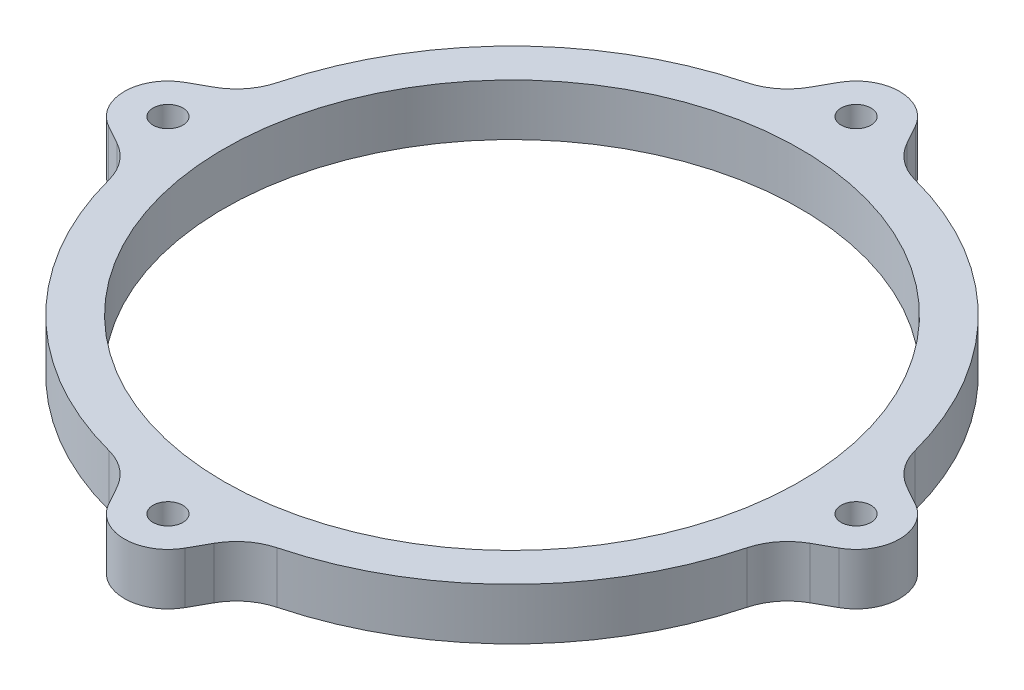
ISO-10303-21;
HEADER;
FILE_DESCRIPTION(('STEP AP214'),'2;1');
FILE_NAME('part.step','',(''),(''),'','','');
FILE_SCHEMA(('AUTOMOTIVE_DESIGN { 1 0 10303 214 1 1 1 1 }'));
ENDSEC;
DATA;
#1=APPLICATION_CONTEXT('core data for automotive mechanical design processes');
#2=APPLICATION_PROTOCOL_DEFINITION('international standard','automotive_design',2000,#1);
#3=PRODUCT_CONTEXT('',#1,'mechanical');
#4=PRODUCT('Part','Part','',(#3));
#5=PRODUCT_RELATED_PRODUCT_CATEGORY('part','',(#4));
#6=PRODUCT_DEFINITION_FORMATION('','',#4);
#7=PRODUCT_DEFINITION_CONTEXT('part definition',#1,'design');
#8=PRODUCT_DEFINITION('design','',#6,#7);
#9=PRODUCT_DEFINITION_SHAPE('','',#8);
#10=(LENGTH_UNIT() NAMED_UNIT(*) SI_UNIT(.MILLI.,.METRE.));
#11=(NAMED_UNIT(*) PLANE_ANGLE_UNIT() SI_UNIT($,.RADIAN.));
#12=(NAMED_UNIT(*) SI_UNIT($,.STERADIAN.) SOLID_ANGLE_UNIT());
#13=UNCERTAINTY_MEASURE_WITH_UNIT(LENGTH_MEASURE(1.E-05),#10,'distance_accuracy_value','');
#14=(GEOMETRIC_REPRESENTATION_CONTEXT(3) GLOBAL_UNCERTAINTY_ASSIGNED_CONTEXT((#13)) GLOBAL_UNIT_ASSIGNED_CONTEXT((#10,
#11,#12)) REPRESENTATION_CONTEXT('',''));
#15=CARTESIAN_POINT('',(0.,0.,0.));
#16=DIRECTION('',(0.,0.,1.));
#17=DIRECTION('',(1.,0.,0.));
#18=AXIS2_PLACEMENT_3D('',#15,#16,#17);
#19=CARTESIAN_POINT('',(0.,9.,-60.));
#20=DIRECTION('',(0.,1.,0.));
#21=DIRECTION('',(0.,0.,1.));
#22=AXIS2_PLACEMENT_3D('',#19,#20,#21);
#23=PLANE('',#22);
#24=CARTESIAN_POINT('',(0.,9.,59.9999999999995));
#25=DIRECTION('',(0.,1.,0.));
#26=DIRECTION('',(0.,0.,1.));
#27=AXIS2_PLACEMENT_3D('',#24,#25,#26);
#28=CIRCLE('',#27,2.6);
#29=CARTESIAN_POINT('',(0.,9.,62.5999999999995));
#30=VERTEX_POINT('',#29);
#31=EDGE_CURVE('E439',#30,#30,#28,.T.);
#32=ORIENTED_EDGE('',*,*,#31,.F.);
#33=EDGE_LOOP('',(#32));
#34=FACE_BOUND('',#33,.T.);
#35=CARTESIAN_POINT('',(0.,9.,-60.));
#36=DIRECTION('',(0.,1.,0.));
#37=DIRECTION('',(0.,0.,1.));
#38=AXIS2_PLACEMENT_3D('',#35,#36,#37);
#39=CIRCLE('',#38,2.6);
#40=CARTESIAN_POINT('',(0.,9.,-57.4));
#41=VERTEX_POINT('',#40);
#42=EDGE_CURVE('E427',#41,#41,#39,.T.);
#43=ORIENTED_EDGE('',*,*,#42,.F.);
#44=EDGE_LOOP('',(#43));
#45=FACE_BOUND('',#44,.T.);
#46=CARTESIAN_POINT('',(0.,9.,-60.));
#47=DIRECTION('',(0.,1.,0.));
#48=DIRECTION('',(0.,0.,1.));
#49=AXIS2_PLACEMENT_3D('',#46,#47,#48);
#50=CIRCLE('',#49,7.6);
#51=CARTESIAN_POINT('',(6.64110523457601,9.,-63.6953648349367));
#52=VERTEX_POINT('',#51);
#53=CARTESIAN_POINT('',(-6.64110523457602,9.,-63.6953648349367));
#54=VERTEX_POINT('',#53);
#55=EDGE_CURVE('E206',#52,#54,#50,.T.);
#56=ORIENTED_EDGE('',*,*,#55,.T.);
#57=DIRECTION('',(-0.486232215123255,0.,0.873829636128423));
#58=VECTOR('',#57,1.);
#59=CARTESIAN_POINT('',(-6.64110523457602,9.,-63.6953648349367));
#60=LINE('',#59,#58);
#61=CARTESIAN_POINT('',(-8.47082751707202,9.,-60.4070891785731));
#62=VERTEX_POINT('',#61);
#63=EDGE_CURVE('E194',#54,#62,#60,.T.);
#64=ORIENTED_EDGE('',*,*,#63,.T.);
#65=CARTESIAN_POINT('',(-17.2091238783562,9.,-65.2694113298057));
#66=DIRECTION('',(0.,1.,0.));
#67=DIRECTION('',(0.,0.,1.));
#68=AXIS2_PLACEMENT_3D('',#65,#66,#67);
#69=CIRCLE('',#68,10.);
#70=CARTESIAN_POINT('',(-14.6596240445257,9.,-55.5998689105752));
#71=VERTEX_POINT('',#70);
#72=EDGE_CURVE('E279',#62,#71,#69,.F.);
#73=ORIENTED_EDGE('',*,*,#72,.T.);
#74=CARTESIAN_POINT('',(0.,9.,0.));
#75=DIRECTION('',(0.,1.,0.));
#76=DIRECTION('',(0.,0.,1.));
#77=AXIS2_PLACEMENT_3D('',#74,#75,#76);
#78=CIRCLE('',#77,57.4999999999999);
#79=CARTESIAN_POINT('',(-55.5998689105752,9.,-14.6596240445258));
#80=VERTEX_POINT('',#79);
#81=EDGE_CURVE('E205',#71,#80,#78,.T.);
#82=ORIENTED_EDGE('',*,*,#81,.T.);
#83=CARTESIAN_POINT('',(-65.2694113298057,9.,-17.2091238783564));
#84=DIRECTION('',(0.,1.,0.));
#85=DIRECTION('',(0.,0.,1.));
#86=AXIS2_PLACEMENT_3D('',#83,#84,#85);
#87=CIRCLE('',#86,10.);
#88=CARTESIAN_POINT('',(-60.4070891785731,9.,-8.47082751707214));
#89=VERTEX_POINT('',#88);
#90=EDGE_CURVE('E283',#80,#89,#87,.F.);
#91=ORIENTED_EDGE('',*,*,#90,.T.);
#92=DIRECTION('',(-0.873829636128424,0.,0.486232215123254));
#93=VECTOR('',#92,1.);
#94=CARTESIAN_POINT('',(-63.6953648349364,9.,-6.64110523457632));
#95=LINE('',#94,#93);
#96=CARTESIAN_POINT('',(-63.6953648349363,9.,-6.6411052345761));
#97=VERTEX_POINT('',#96);
#98=EDGE_CURVE('E377',#89,#97,#95,.T.);
#99=ORIENTED_EDGE('',*,*,#98,.T.);
#100=CARTESIAN_POINT('',(-59.9999999999997,9.,0.));
#101=DIRECTION('',(0.,1.,0.));
#102=DIRECTION('',(0.,0.,1.));
#103=AXIS2_PLACEMENT_3D('',#100,#101,#102);
#104=CIRCLE('',#103,7.59999999999999);
#105=CARTESIAN_POINT('',(-63.6953648349364,9.,6.6411052345757));
#106=VERTEX_POINT('',#105);
#107=EDGE_CURVE('E374',#97,#106,#104,.T.);
#108=ORIENTED_EDGE('',*,*,#107,.T.);
#109=DIRECTION('',(0.873829636128421,0.,0.486232215123259));
#110=VECTOR('',#109,1.);
#111=CARTESIAN_POINT('',(-63.6953648349364,9.,6.6411052345757));
#112=LINE('',#111,#110);
#113=CARTESIAN_POINT('',(-60.407089178573,9.,8.47082751707166));
#114=VERTEX_POINT('',#113);
#115=EDGE_CURVE('E366',#106,#114,#112,.T.);
#116=ORIENTED_EDGE('',*,*,#115,.T.);
#117=CARTESIAN_POINT('',(-65.2694113298056,9.,17.2091238783559));
#118=DIRECTION('',(0.,1.,0.));
#119=DIRECTION('',(0.,0.,1.));
#120=AXIS2_PLACEMENT_3D('',#117,#118,#119);
#121=CIRCLE('',#120,10.);
#122=CARTESIAN_POINT('',(-55.5998689105751,9.,14.6596240445254));
#123=VERTEX_POINT('',#122);
#124=EDGE_CURVE('E287',#114,#123,#121,.F.);
#125=ORIENTED_EDGE('',*,*,#124,.T.);
#126=CARTESIAN_POINT('',(0.,9.,0.));
#127=DIRECTION('',(0.,1.,0.));
#128=DIRECTION('',(0.,0.,1.));
#129=AXIS2_PLACEMENT_3D('',#126,#127,#128);
#130=CIRCLE('',#129,57.4999999999996);
#131=CARTESIAN_POINT('',(-14.6596240445255,9.,55.599868910575));
#132=VERTEX_POINT('',#131);
#133=EDGE_CURVE('E298',#123,#132,#130,.T.);
#134=ORIENTED_EDGE('',*,*,#133,.T.);
#135=CARTESIAN_POINT('',(-17.209123878356,9.,65.2694113298055));
#136=DIRECTION('',(0.,1.,0.));
#137=DIRECTION('',(0.,0.,1.));
#138=AXIS2_PLACEMENT_3D('',#135,#136,#137);
#139=CIRCLE('',#138,10.);
#140=CARTESIAN_POINT('',(-8.47082751707182,9.,60.407089178573));
#141=VERTEX_POINT('',#140);
#142=EDGE_CURVE('E291',#132,#141,#139,.F.);
#143=ORIENTED_EDGE('',*,*,#142,.T.);
#144=DIRECTION('',(0.486232215123255,0.,0.873829636128423));
#145=VECTOR('',#144,1.);
#146=CARTESIAN_POINT('',(-6.64110523457596,9.,63.6953648349363));
#147=LINE('',#146,#145);
#148=CARTESIAN_POINT('',(-6.64110523457601,9.,63.6953648349363));
#149=VERTEX_POINT('',#148);
#150=EDGE_CURVE('E295',#141,#149,#147,.T.);
#151=ORIENTED_EDGE('',*,*,#150,.T.);
#152=CARTESIAN_POINT('',(0.,9.,59.9999999999995));
#153=DIRECTION('',(0.,1.,0.));
#154=DIRECTION('',(0.,0.,1.));
#155=AXIS2_PLACEMENT_3D('',#152,#153,#154);
#156=CIRCLE('',#155,7.60000000000002);
#157=CARTESIAN_POINT('',(6.64110523457607,9.,63.6953648349363));
#158=VERTEX_POINT('',#157);
#159=EDGE_CURVE('E308',#149,#158,#156,.T.);
#160=ORIENTED_EDGE('',*,*,#159,.T.);
#161=DIRECTION('',(0.486232215123259,0.,-0.873829636128421));
#162=VECTOR('',#161,1.);
#163=CARTESIAN_POINT('',(6.64110523457607,9.,63.6953648349363));
#164=LINE('',#163,#162);
#165=CARTESIAN_POINT('',(8.47082751707193,9.,60.407089178573));
#166=VERTEX_POINT('',#165);
#167=EDGE_CURVE('E382',#158,#166,#164,.T.);
#168=ORIENTED_EDGE('',*,*,#167,.T.);
#169=CARTESIAN_POINT('',(17.2091238783561,9.,65.2694113298056));
#170=DIRECTION('',(0.,1.,0.));
#171=DIRECTION('',(0.,0.,1.));
#172=AXIS2_PLACEMENT_3D('',#169,#170,#171);
#173=CIRCLE('',#172,10.);
#174=CARTESIAN_POINT('',(14.6596240445256,9.,55.5998689105751));
#175=VERTEX_POINT('',#174);
#176=EDGE_CURVE('E11',#166,#175,#173,.F.);
#177=ORIENTED_EDGE('',*,*,#176,.T.);
#178=CARTESIAN_POINT('',(0.,9.,0.));
#179=DIRECTION('',(0.,1.,0.));
#180=DIRECTION('',(0.,0.,1.));
#181=AXIS2_PLACEMENT_3D('',#178,#179,#180);
#182=CIRCLE('',#181,57.4999999999997);
#183=CARTESIAN_POINT('',(55.5998689105752,9.,14.6596240445254));
#184=VERTEX_POINT('',#183);
#185=EDGE_CURVE('E384',#175,#184,#182,.T.);
#186=ORIENTED_EDGE('',*,*,#185,.T.);
#187=CARTESIAN_POINT('',(65.2694113298056,9.,17.209123878356));
#188=DIRECTION('',(0.,1.,0.));
#189=DIRECTION('',(0.,0.,1.));
#190=AXIS2_PLACEMENT_3D('',#187,#188,#189);
#191=CIRCLE('',#190,10.);
#192=CARTESIAN_POINT('',(60.4070891785731,9.,8.47082751707175));
#193=VERTEX_POINT('',#192);
#194=EDGE_CURVE('E267',#184,#193,#191,.F.);
#195=ORIENTED_EDGE('',*,*,#194,.T.);
#196=DIRECTION('',(0.873829636128423,0.,-0.486232215123256));
#197=VECTOR('',#196,1.);
#198=CARTESIAN_POINT('',(63.6953648349366,9.,6.64110523457578));
#199=LINE('',#198,#197);
#200=CARTESIAN_POINT('',(63.6953648349365,9.,6.64110523457553));
#201=VERTEX_POINT('',#200);
#202=EDGE_CURVE('E387',#193,#201,#199,.T.);
#203=ORIENTED_EDGE('',*,*,#202,.T.);
#204=CARTESIAN_POINT('',(59.9999999999999,9.,-5.62050406216485E-13));
#205=DIRECTION('',(0.,1.,0.));
#206=DIRECTION('',(0.,0.,1.));
#207=AXIS2_PLACEMENT_3D('',#204,#205,#206);
#208=CIRCLE('',#207,7.59999999999999);
#209=CARTESIAN_POINT('',(63.6953648349367,9.,-6.64110523457625));
#210=VERTEX_POINT('',#209);
#211=EDGE_CURVE('E389',#201,#210,#208,.T.);
#212=ORIENTED_EDGE('',*,*,#211,.T.);
#213=DIRECTION('',(-0.873829636128422,0.,-0.486232215123257));
#214=VECTOR('',#213,1.);
#215=CARTESIAN_POINT('',(63.6953648349367,9.,-6.64110523457625));
#216=LINE('',#215,#214);
#217=CARTESIAN_POINT('',(60.4070891785732,9.,-8.47082751707216));
#218=VERTEX_POINT('',#217);
#219=EDGE_CURVE('E391',#210,#218,#216,.T.);
#220=ORIENTED_EDGE('',*,*,#219,.T.);
#221=CARTESIAN_POINT('',(65.2694113298058,9.,-17.2091238783564));
#222=DIRECTION('',(0.,1.,0.));
#223=DIRECTION('',(0.,0.,1.));
#224=AXIS2_PLACEMENT_3D('',#221,#222,#223);
#225=CIRCLE('',#224,10.);
#226=CARTESIAN_POINT('',(55.5998689105753,9.,-14.6596240445258));
#227=VERTEX_POINT('',#226);
#228=EDGE_CURVE('E271',#218,#227,#225,.F.);
#229=ORIENTED_EDGE('',*,*,#228,.T.);
#230=CARTESIAN_POINT('',(0.,9.,0.));
#231=DIRECTION('',(0.,1.,0.));
#232=DIRECTION('',(0.,0.,1.));
#233=AXIS2_PLACEMENT_3D('',#230,#231,#232);
#234=CIRCLE('',#233,57.5);
#235=CARTESIAN_POINT('',(14.6596240445256,9.,-55.5998689105754));
#236=VERTEX_POINT('',#235);
#237=EDGE_CURVE('E394',#227,#236,#234,.T.);
#238=ORIENTED_EDGE('',*,*,#237,.T.);
#239=CARTESIAN_POINT('',(17.2091238783562,9.,-65.2694113298058));
#240=DIRECTION('',(0.,1.,0.));
#241=DIRECTION('',(0.,0.,1.));
#242=AXIS2_PLACEMENT_3D('',#239,#240,#241);
#243=CIRCLE('',#242,10.);
#244=CARTESIAN_POINT('',(8.47082751707194,9.,-60.4070891785733));
#245=VERTEX_POINT('',#244);
#246=EDGE_CURVE('E275',#236,#245,#243,.F.);
#247=ORIENTED_EDGE('',*,*,#246,.T.);
#248=DIRECTION('',(-0.486232215123257,0.,-0.873829636128422));
#249=VECTOR('',#248,1.);
#250=CARTESIAN_POINT('',(6.64110523457601,9.,-63.6953648349367));
#251=LINE('',#250,#249);
#252=EDGE_CURVE('E211',#245,#52,#251,.T.);
#253=ORIENTED_EDGE('',*,*,#252,.T.);
#254=EDGE_LOOP('',(#56,#64,#73,#82,#91,#99,#108,#116,#125,#134,#143,#151,#160,#168,#177,#186,
#195,#203,#212,#220,#229,#238,#247,#253));
#255=FACE_BOUND('',#254,.T.);
#256=CARTESIAN_POINT('',(0.,9.,0.));
#257=DIRECTION('',(0.,1.,0.));
#258=DIRECTION('',(0.,0.,1.));
#259=AXIS2_PLACEMENT_3D('',#256,#257,#258);
#260=CIRCLE('',#259,50.25);
#261=CARTESIAN_POINT('',(0.,9.,50.25));
#262=VERTEX_POINT('',#261);
#263=EDGE_CURVE('E400',#262,#262,#260,.T.);
#264=ORIENTED_EDGE('',*,*,#263,.F.);
#265=EDGE_LOOP('',(#264));
#266=FACE_BOUND('',#265,.T.);
#267=CARTESIAN_POINT('',(59.9999999999999,9.,-5.62050406216485E-13));
#268=DIRECTION('',(0.,1.,0.));
#269=DIRECTION('',(0.,0.,1.));
#270=AXIS2_PLACEMENT_3D('',#267,#268,#269);
#271=CIRCLE('',#270,2.6);
#272=CARTESIAN_POINT('',(59.9999999999999,9.,2.59999999999944));
#273=VERTEX_POINT('',#272);
#274=EDGE_CURVE('E433',#273,#273,#271,.T.);
#275=ORIENTED_EDGE('',*,*,#274,.F.);
#276=EDGE_LOOP('',(#275));
#277=FACE_BOUND('',#276,.T.);
#278=CARTESIAN_POINT('',(-59.9999999999997,9.,0.));
#279=DIRECTION('',(0.,1.,0.));
#280=DIRECTION('',(0.,0.,1.));
#281=AXIS2_PLACEMENT_3D('',#278,#279,#280);
#282=CIRCLE('',#281,2.6);
#283=CARTESIAN_POINT('',(-59.9999999999997,9.,2.6));
#284=VERTEX_POINT('',#283);
#285=EDGE_CURVE('E445',#284,#284,#282,.T.);
#286=ORIENTED_EDGE('',*,*,#285,.F.);
#287=EDGE_LOOP('',(#286));
#288=FACE_BOUND('',#287,.T.);
#289=ADVANCED_FACE('F33',(#34,#45,#255,#266,#277,#288),#23,.T.);
#290=CARTESIAN_POINT('',(0.,0.,-60.));
#291=DIRECTION('',(0.,1.,0.));
#292=DIRECTION('',(0.,0.,1.));
#293=AXIS2_PLACEMENT_3D('',#290,#291,#292);
#294=PLANE('',#293);
#295=CARTESIAN_POINT('',(0.,0.,-60.));
#296=DIRECTION('',(0.,1.,0.));
#297=DIRECTION('',(0.,0.,1.));
#298=AXIS2_PLACEMENT_3D('',#295,#296,#297);
#299=CIRCLE('',#298,7.6);
#300=CARTESIAN_POINT('',(6.64110523457601,0.,-63.6953648349367));
#301=VERTEX_POINT('',#300);
#302=CARTESIAN_POINT('',(-6.64110523457602,0.,-63.6953648349367));
#303=VERTEX_POINT('',#302);
#304=EDGE_CURVE('E219',#301,#303,#299,.T.);
#305=ORIENTED_EDGE('',*,*,#304,.F.);
#306=DIRECTION('',(-0.486232215123257,0.,-0.873829636128422));
#307=VECTOR('',#306,1.);
#308=CARTESIAN_POINT('',(6.64110523457601,0.,-63.6953648349367));
#309=LINE('',#308,#307);
#310=CARTESIAN_POINT('',(8.47082751707194,0.,-60.4070891785733));
#311=VERTEX_POINT('',#310);
#312=EDGE_CURVE('E215',#311,#301,#309,.T.);
#313=ORIENTED_EDGE('',*,*,#312,.F.);
#314=CARTESIAN_POINT('',(17.2091238783562,0.,-65.2694113298058));
#315=DIRECTION('',(0.,1.,0.));
#316=DIRECTION('',(0.,0.,1.));
#317=AXIS2_PLACEMENT_3D('',#314,#315,#316);
#318=CIRCLE('',#317,10.);
#319=CARTESIAN_POINT('',(14.6596240445256,0.,-55.5998689105754));
#320=VERTEX_POINT('',#319);
#321=EDGE_CURVE('E273',#311,#320,#318,.T.);
#322=ORIENTED_EDGE('',*,*,#321,.T.);
#323=CARTESIAN_POINT('',(0.,0.,0.));
#324=DIRECTION('',(0.,1.,0.));
#325=DIRECTION('',(0.,0.,1.));
#326=AXIS2_PLACEMENT_3D('',#323,#324,#325);
#327=CIRCLE('',#326,57.5);
#328=CARTESIAN_POINT('',(55.5998689105753,0.,-14.6596240445258));
#329=VERTEX_POINT('',#328);
#330=EDGE_CURVE('E343',#329,#320,#327,.T.);
#331=ORIENTED_EDGE('',*,*,#330,.F.);
#332=CARTESIAN_POINT('',(65.2694113298058,0.,-17.2091238783564));
#333=DIRECTION('',(0.,1.,0.));
#334=DIRECTION('',(0.,0.,1.));
#335=AXIS2_PLACEMENT_3D('',#332,#333,#334);
#336=CIRCLE('',#335,10.);
#337=CARTESIAN_POINT('',(60.4070891785732,0.,-8.47082751707216));
#338=VERTEX_POINT('',#337);
#339=EDGE_CURVE('E269',#329,#338,#336,.T.);
#340=ORIENTED_EDGE('',*,*,#339,.T.);
#341=DIRECTION('',(-0.873829636128422,0.,-0.486232215123257));
#342=VECTOR('',#341,1.);
#343=CARTESIAN_POINT('',(63.6953648349367,0.,-6.64110523457625));
#344=LINE('',#343,#342);
#345=CARTESIAN_POINT('',(63.6953648349367,0.,-6.64110523457625));
#346=VERTEX_POINT('',#345);
#347=EDGE_CURVE('E340',#346,#338,#344,.T.);
#348=ORIENTED_EDGE('',*,*,#347,.F.);
#349=CARTESIAN_POINT('',(59.9999999999999,0.,-5.62050406216485E-13));
#350=DIRECTION('',(0.,1.,0.));
#351=DIRECTION('',(0.,0.,1.));
#352=AXIS2_PLACEMENT_3D('',#349,#350,#351);
#353=CIRCLE('',#352,7.59999999999999);
#354=CARTESIAN_POINT('',(63.6953648349365,0.,6.64110523457553));
#355=VERTEX_POINT('',#354);
#356=EDGE_CURVE('E338',#355,#346,#353,.T.);
#357=ORIENTED_EDGE('',*,*,#356,.F.);
#358=DIRECTION('',(0.873829636128423,0.,-0.486232215123256));
#359=VECTOR('',#358,1.);
#360=CARTESIAN_POINT('',(63.6953648349366,0.,6.64110523457578));
#361=LINE('',#360,#359);
#362=CARTESIAN_POINT('',(60.4070891785731,0.,8.47082751707175));
#363=VERTEX_POINT('',#362);
#364=EDGE_CURVE('E336',#363,#355,#361,.T.);
#365=ORIENTED_EDGE('',*,*,#364,.F.);
#366=CARTESIAN_POINT('',(65.2694113298056,0.,17.209123878356));
#367=DIRECTION('',(0.,1.,0.));
#368=DIRECTION('',(0.,0.,1.));
#369=AXIS2_PLACEMENT_3D('',#366,#367,#368);
#370=CIRCLE('',#369,10.);
#371=CARTESIAN_POINT('',(55.5998689105752,0.,14.6596240445254));
#372=VERTEX_POINT('',#371);
#373=EDGE_CURVE('E265',#363,#372,#370,.T.);
#374=ORIENTED_EDGE('',*,*,#373,.T.);
#375=CARTESIAN_POINT('',(0.,0.,0.));
#376=DIRECTION('',(0.,1.,0.));
#377=DIRECTION('',(0.,0.,1.));
#378=AXIS2_PLACEMENT_3D('',#375,#376,#377);
#379=CIRCLE('',#378,57.4999999999997);
#380=CARTESIAN_POINT('',(14.6596240445256,0.,55.5998689105751));
#381=VERTEX_POINT('',#380);
#382=EDGE_CURVE('E333',#381,#372,#379,.T.);
#383=ORIENTED_EDGE('',*,*,#382,.F.);
#384=CARTESIAN_POINT('',(17.2091238783561,0.,65.2694113298056));
#385=DIRECTION('',(0.,1.,0.));
#386=DIRECTION('',(0.,0.,1.));
#387=AXIS2_PLACEMENT_3D('',#384,#385,#386);
#388=CIRCLE('',#387,10.);
#389=CARTESIAN_POINT('',(8.47082751707193,0.,60.407089178573));
#390=VERTEX_POINT('',#389);
#391=EDGE_CURVE('E41',#381,#390,#388,.T.);
#392=ORIENTED_EDGE('',*,*,#391,.T.);
#393=DIRECTION('',(0.486232215123259,0.,-0.873829636128421));
#394=VECTOR('',#393,1.);
#395=CARTESIAN_POINT('',(6.64110523457607,0.,63.6953648349363));
#396=LINE('',#395,#394);
#397=CARTESIAN_POINT('',(6.64110523457607,0.,63.6953648349363));
#398=VERTEX_POINT('',#397);
#399=EDGE_CURVE('E331',#398,#390,#396,.T.);
#400=ORIENTED_EDGE('',*,*,#399,.F.);
#401=CARTESIAN_POINT('',(0.,0.,59.9999999999995));
#402=DIRECTION('',(0.,1.,0.));
#403=DIRECTION('',(0.,0.,1.));
#404=AXIS2_PLACEMENT_3D('',#401,#402,#403);
#405=CIRCLE('',#404,7.60000000000002);
#406=CARTESIAN_POINT('',(-6.64110523457601,0.,63.6953648349363));
#407=VERTEX_POINT('',#406);
#408=EDGE_CURVE('E323',#407,#398,#405,.T.);
#409=ORIENTED_EDGE('',*,*,#408,.F.);
#410=DIRECTION('',(0.486232215123255,0.,0.873829636128423));
#411=VECTOR('',#410,1.);
#412=CARTESIAN_POINT('',(-6.64110523457596,0.,63.6953648349363));
#413=LINE('',#412,#411);
#414=CARTESIAN_POINT('',(-8.47082751707182,0.,60.407089178573));
#415=VERTEX_POINT('',#414);
#416=EDGE_CURVE('E317',#415,#407,#413,.T.);
#417=ORIENTED_EDGE('',*,*,#416,.F.);
#418=CARTESIAN_POINT('',(-17.209123878356,0.,65.2694113298055));
#419=DIRECTION('',(0.,1.,0.));
#420=DIRECTION('',(0.,0.,1.));
#421=AXIS2_PLACEMENT_3D('',#418,#419,#420);
#422=CIRCLE('',#421,10.);
#423=CARTESIAN_POINT('',(-14.6596240445255,0.,55.599868910575));
#424=VERTEX_POINT('',#423);
#425=EDGE_CURVE('E289',#415,#424,#422,.T.);
#426=ORIENTED_EDGE('',*,*,#425,.T.);
#427=CARTESIAN_POINT('',(0.,0.,0.));
#428=DIRECTION('',(0.,1.,0.));
#429=DIRECTION('',(0.,0.,1.));
#430=AXIS2_PLACEMENT_3D('',#427,#428,#429);
#431=CIRCLE('',#430,57.4999999999996);
#432=CARTESIAN_POINT('',(-55.5998689105751,0.,14.6596240445254));
#433=VERTEX_POINT('',#432);
#434=EDGE_CURVE('E315',#433,#424,#431,.T.);
#435=ORIENTED_EDGE('',*,*,#434,.F.);
#436=CARTESIAN_POINT('',(-65.2694113298056,0.,17.2091238783559));
#437=DIRECTION('',(0.,1.,0.));
#438=DIRECTION('',(0.,0.,1.));
#439=AXIS2_PLACEMENT_3D('',#436,#437,#438);
#440=CIRCLE('',#439,10.);
#441=CARTESIAN_POINT('',(-60.407089178573,0.,8.47082751707166));
#442=VERTEX_POINT('',#441);
#443=EDGE_CURVE('E285',#433,#442,#440,.T.);
#444=ORIENTED_EDGE('',*,*,#443,.T.);
#445=DIRECTION('',(0.873829636128421,0.,0.486232215123259));
#446=VECTOR('',#445,1.);
#447=CARTESIAN_POINT('',(-63.6953648349364,0.,6.6411052345757));
#448=LINE('',#447,#446);
#449=CARTESIAN_POINT('',(-63.6953648349364,0.,6.6411052345757));
#450=VERTEX_POINT('',#449);
#451=EDGE_CURVE('E321',#450,#442,#448,.T.);
#452=ORIENTED_EDGE('',*,*,#451,.F.);
#453=CARTESIAN_POINT('',(-59.9999999999997,0.,0.));
#454=DIRECTION('',(0.,1.,0.));
#455=DIRECTION('',(0.,0.,1.));
#456=AXIS2_PLACEMENT_3D('',#453,#454,#455);
#457=CIRCLE('',#456,7.59999999999999);
#458=CARTESIAN_POINT('',(-63.6953648349363,0.,-6.6411052345761));
#459=VERTEX_POINT('',#458);
#460=EDGE_CURVE('E326',#459,#450,#457,.T.);
#461=ORIENTED_EDGE('',*,*,#460,.F.);
#462=DIRECTION('',(-0.873829636128424,0.,0.486232215123254));
#463=VECTOR('',#462,1.);
#464=CARTESIAN_POINT('',(-63.6953648349364,0.,-6.64110523457632));
#465=LINE('',#464,#463);
#466=CARTESIAN_POINT('',(-60.4070891785731,0.,-8.47082751707214));
#467=VERTEX_POINT('',#466);
#468=EDGE_CURVE('E405',#467,#459,#465,.T.);
#469=ORIENTED_EDGE('',*,*,#468,.F.);
#470=CARTESIAN_POINT('',(-65.2694113298057,0.,-17.2091238783564));
#471=DIRECTION('',(0.,1.,0.));
#472=DIRECTION('',(0.,0.,1.));
#473=AXIS2_PLACEMENT_3D('',#470,#471,#472);
#474=CIRCLE('',#473,10.);
#475=CARTESIAN_POINT('',(-55.5998689105752,0.,-14.6596240445258));
#476=VERTEX_POINT('',#475);
#477=EDGE_CURVE('E281',#467,#476,#474,.T.);
#478=ORIENTED_EDGE('',*,*,#477,.T.);
#479=CARTESIAN_POINT('',(0.,0.,0.));
#480=DIRECTION('',(0.,1.,0.));
#481=DIRECTION('',(0.,0.,1.));
#482=AXIS2_PLACEMENT_3D('',#479,#480,#481);
#483=CIRCLE('',#482,57.4999999999999);
#484=CARTESIAN_POINT('',(-14.6596240445257,0.,-55.5998689105752));
#485=VERTEX_POINT('',#484);
#486=EDGE_CURVE('E402',#485,#476,#483,.T.);
#487=ORIENTED_EDGE('',*,*,#486,.F.);
#488=CARTESIAN_POINT('',(-17.2091238783562,0.,-65.2694113298057));
#489=DIRECTION('',(0.,1.,0.));
#490=DIRECTION('',(0.,0.,1.));
#491=AXIS2_PLACEMENT_3D('',#488,#489,#490);
#492=CIRCLE('',#491,10.);
#493=CARTESIAN_POINT('',(-8.47082751707202,0.,-60.4070891785731));
#494=VERTEX_POINT('',#493);
#495=EDGE_CURVE('E277',#485,#494,#492,.T.);
#496=ORIENTED_EDGE('',*,*,#495,.T.);
#497=DIRECTION('',(-0.486232215123255,0.,0.873829636128423));
#498=VECTOR('',#497,1.);
#499=CARTESIAN_POINT('',(-6.64110523457602,0.,-63.6953648349367));
#500=LINE('',#499,#498);
#501=EDGE_CURVE('E399',#303,#494,#500,.T.);
#502=ORIENTED_EDGE('',*,*,#501,.F.);
#503=EDGE_LOOP('',(#305,#313,#322,#331,#340,#348,#357,#365,#374,#383,#392,#400,#409,#417,#426,
#435,#444,#452,#461,#469,#478,#487,#496,#502));
#504=FACE_BOUND('',#503,.T.);
#505=CARTESIAN_POINT('',(0.,0.,0.));
#506=DIRECTION('',(0.,1.,0.));
#507=DIRECTION('',(0.,0.,1.));
#508=AXIS2_PLACEMENT_3D('',#505,#506,#507);
#509=CIRCLE('',#508,50.25);
#510=CARTESIAN_POINT('',(0.,0.,50.25));
#511=VERTEX_POINT('',#510);
#512=EDGE_CURVE('E424',#511,#511,#509,.T.);
#513=ORIENTED_EDGE('',*,*,#512,.T.);
#514=EDGE_LOOP('',(#513));
#515=FACE_BOUND('',#514,.T.);
#516=CARTESIAN_POINT('',(0.,0.,-60.));
#517=DIRECTION('',(0.,1.,0.));
#518=DIRECTION('',(0.,0.,1.));
#519=AXIS2_PLACEMENT_3D('',#516,#517,#518);
#520=CIRCLE('',#519,2.6);
#521=CARTESIAN_POINT('',(0.,0.,-57.4));
#522=VERTEX_POINT('',#521);
#523=EDGE_CURVE('E430',#522,#522,#520,.T.);
#524=ORIENTED_EDGE('',*,*,#523,.T.);
#525=EDGE_LOOP('',(#524));
#526=FACE_BOUND('',#525,.T.);
#527=CARTESIAN_POINT('',(59.9999999999999,0.,-5.62050406216485E-13));
#528=DIRECTION('',(0.,1.,0.));
#529=DIRECTION('',(0.,0.,1.));
#530=AXIS2_PLACEMENT_3D('',#527,#528,#529);
#531=CIRCLE('',#530,2.6);
#532=CARTESIAN_POINT('',(59.9999999999999,0.,2.59999999999944));
#533=VERTEX_POINT('',#532);
#534=EDGE_CURVE('E436',#533,#533,#531,.T.);
#535=ORIENTED_EDGE('',*,*,#534,.T.);
#536=EDGE_LOOP('',(#535));
#537=FACE_BOUND('',#536,.T.);
#538=CARTESIAN_POINT('',(0.,0.,59.9999999999995));
#539=DIRECTION('',(0.,1.,0.));
#540=DIRECTION('',(0.,0.,1.));
#541=AXIS2_PLACEMENT_3D('',#538,#539,#540);
#542=CIRCLE('',#541,2.6);
#543=CARTESIAN_POINT('',(0.,0.,62.5999999999995));
#544=VERTEX_POINT('',#543);
#545=EDGE_CURVE('E442',#544,#544,#542,.T.);
#546=ORIENTED_EDGE('',*,*,#545,.T.);
#547=EDGE_LOOP('',(#546));
#548=FACE_BOUND('',#547,.T.);
#549=CARTESIAN_POINT('',(-59.9999999999997,0.,0.));
#550=DIRECTION('',(0.,1.,0.));
#551=DIRECTION('',(0.,0.,1.));
#552=AXIS2_PLACEMENT_3D('',#549,#550,#551);
#553=CIRCLE('',#552,2.6);
#554=CARTESIAN_POINT('',(-59.9999999999997,0.,2.6));
#555=VERTEX_POINT('',#554);
#556=EDGE_CURVE('E448',#555,#555,#553,.T.);
#557=ORIENTED_EDGE('',*,*,#556,.T.);
#558=EDGE_LOOP('',(#557));
#559=FACE_BOUND('',#558,.T.);
#560=ADVANCED_FACE('F313',(#504,#515,#526,#537,#548,#559),#294,.F.);
#561=CARTESIAN_POINT('',(0.,9.,-60.));
#562=DIRECTION('',(0.,-1.,0.));
#563=DIRECTION('',(0.,0.,-1.));
#564=AXIS2_PLACEMENT_3D('',#561,#562,#563);
#565=CYLINDRICAL_SURFACE('',#564,7.6);
#566=ORIENTED_EDGE('',*,*,#304,.T.);
#567=DIRECTION('',(0.,-1.,0.));
#568=VECTOR('',#567,1.);
#569=CARTESIAN_POINT('',(-6.64110523457602,9.,-63.6953648349367));
#570=LINE('',#569,#568);
#571=EDGE_CURVE('E199',#54,#303,#570,.T.);
#572=ORIENTED_EDGE('',*,*,#571,.F.);
#573=ORIENTED_EDGE('',*,*,#55,.F.);
#574=DIRECTION('',(0.,-1.,0.));
#575=VECTOR('',#574,1.);
#576=CARTESIAN_POINT('',(6.64110523457601,9.,-63.6953648349367));
#577=LINE('',#576,#575);
#578=EDGE_CURVE('E347',#52,#301,#577,.T.);
#579=ORIENTED_EDGE('',*,*,#578,.T.);
#580=EDGE_LOOP('',(#566,#572,#573,#579));
#581=FACE_BOUND('',#580,.T.);
#582=ADVANCED_FACE('F217',(#581),#565,.T.);
#583=CARTESIAN_POINT('',(-6.64110523457602,9.,-63.6953648349367));
#584=DIRECTION('',(0.873829636128423,0.,0.486232215123255));
#585=DIRECTION('',(0.486232215123255,0.,-0.873829636128423));
#586=AXIS2_PLACEMENT_3D('',#583,#584,#585);
#587=PLANE('',#586);
#588=ORIENTED_EDGE('',*,*,#501,.T.);
#589=DIRECTION('',(0.,1.,0.));
#590=VECTOR('',#589,1.);
#591=CARTESIAN_POINT('',(-8.47082751707202,9.,-60.4070891785731));
#592=LINE('',#591,#590);
#593=EDGE_CURVE('E202',#494,#62,#592,.T.);
#594=ORIENTED_EDGE('',*,*,#593,.T.);
#595=ORIENTED_EDGE('',*,*,#63,.F.);
#596=ORIENTED_EDGE('',*,*,#571,.T.);
#597=EDGE_LOOP('',(#588,#594,#595,#596));
#598=FACE_BOUND('',#597,.T.);
#599=ADVANCED_FACE('F197',(#598),#587,.F.);
#600=CARTESIAN_POINT('',(0.,9.,0.));
#601=DIRECTION('',(0.,-1.,0.));
#602=DIRECTION('',(0.,0.,-1.));
#603=AXIS2_PLACEMENT_3D('',#600,#601,#602);
#604=CYLINDRICAL_SURFACE('',#603,57.4999999999999);
#605=ORIENTED_EDGE('',*,*,#81,.F.);
#606=DIRECTION('',(0.,-1.,0.));
#607=VECTOR('',#606,1.);
#608=CARTESIAN_POINT('',(-14.6596240445257,9.,-55.5998689105752));
#609=LINE('',#608,#607);
#610=EDGE_CURVE('E247',#71,#485,#609,.T.);
#611=ORIENTED_EDGE('',*,*,#610,.T.);
#612=ORIENTED_EDGE('',*,*,#486,.T.);
#613=DIRECTION('',(0.,-1.,0.));
#614=VECTOR('',#613,1.);
#615=CARTESIAN_POINT('',(-55.5998689105752,9.,-14.6596240445258));
#616=LINE('',#615,#614);
#617=EDGE_CURVE('E245',#476,#80,#616,.F.);
#618=ORIENTED_EDGE('',*,*,#617,.T.);
#619=EDGE_LOOP('',(#605,#611,#612,#618));
#620=FACE_BOUND('',#619,.T.);
#621=ADVANCED_FACE('F417',(#620),#604,.T.);
#622=CARTESIAN_POINT('',(-63.6953648349364,9.,-6.64110523457632));
#623=DIRECTION('',(0.486232215123254,0.,0.873829636128423));
#624=DIRECTION('',(0.873829636128424,0.,-0.486232215123255));
#625=AXIS2_PLACEMENT_3D('',#622,#623,#624);
#626=PLANE('',#625);
#627=ORIENTED_EDGE('',*,*,#98,.F.);
#628=DIRECTION('',(0.,1.,0.));
#629=VECTOR('',#628,1.);
#630=CARTESIAN_POINT('',(-60.4070891785731,0.,-8.47082751707214));
#631=LINE('',#630,#629);
#632=EDGE_CURVE('E251',#89,#467,#631,.F.);
#633=ORIENTED_EDGE('',*,*,#632,.T.);
#634=ORIENTED_EDGE('',*,*,#468,.T.);
#635=DIRECTION('',(0.,-1.,0.));
#636=VECTOR('',#635,1.);
#637=CARTESIAN_POINT('',(-63.6953648349363,9.,-6.6411052345761));
#638=LINE('',#637,#636);
#639=EDGE_CURVE('E221',#97,#459,#638,.T.);
#640=ORIENTED_EDGE('',*,*,#639,.F.);
#641=EDGE_LOOP('',(#627,#633,#634,#640));
#642=FACE_BOUND('',#641,.T.);
#643=ADVANCED_FACE('F410',(#642),#626,.F.);
#644=CARTESIAN_POINT('',(-59.9999999999997,9.,0.));
#645=DIRECTION('',(0.,-1.,0.));
#646=DIRECTION('',(0.,0.,-1.));
#647=AXIS2_PLACEMENT_3D('',#644,#645,#646);
#648=CYLINDRICAL_SURFACE('',#647,7.59999999999999);
#649=ORIENTED_EDGE('',*,*,#460,.T.);
#650=DIRECTION('',(0.,-1.,0.));
#651=VECTOR('',#650,1.);
#652=CARTESIAN_POINT('',(-63.6953648349364,9.,6.6411052345757));
#653=LINE('',#652,#651);
#654=EDGE_CURVE('E227',#106,#450,#653,.T.);
#655=ORIENTED_EDGE('',*,*,#654,.F.);
#656=ORIENTED_EDGE('',*,*,#107,.F.);
#657=ORIENTED_EDGE('',*,*,#639,.T.);
#658=EDGE_LOOP('',(#649,#655,#656,#657));
#659=FACE_BOUND('',#658,.T.);
#660=ADVANCED_FACE('F406',(#659),#648,.T.);
#661=CARTESIAN_POINT('',(-63.6953648349364,9.,6.6411052345757));
#662=DIRECTION('',(0.486232215123259,0.,-0.873829636128421));
#663=DIRECTION('',(-0.873829636128421,0.,-0.486232215123259));
#664=AXIS2_PLACEMENT_3D('',#661,#662,#663);
#665=PLANE('',#664);
#666=ORIENTED_EDGE('',*,*,#451,.T.);
#667=DIRECTION('',(0.,1.,0.));
#668=VECTOR('',#667,1.);
#669=CARTESIAN_POINT('',(-60.407089178573,9.,8.47082751707166));
#670=LINE('',#669,#668);
#671=EDGE_CURVE('E259',#442,#114,#670,.T.);
#672=ORIENTED_EDGE('',*,*,#671,.T.);
#673=ORIENTED_EDGE('',*,*,#115,.F.);
#674=ORIENTED_EDGE('',*,*,#654,.T.);
#675=EDGE_LOOP('',(#666,#672,#673,#674));
#676=FACE_BOUND('',#675,.T.);
#677=ADVANCED_FACE('F363',(#676),#665,.F.);
#678=CARTESIAN_POINT('',(0.,9.,0.));
#679=DIRECTION('',(0.,-1.,0.));
#680=DIRECTION('',(0.,0.,-1.));
#681=AXIS2_PLACEMENT_3D('',#678,#679,#680);
#682=CYLINDRICAL_SURFACE('',#681,57.4999999999996);
#683=ORIENTED_EDGE('',*,*,#133,.F.);
#684=DIRECTION('',(0.,-1.,0.));
#685=VECTOR('',#684,1.);
#686=CARTESIAN_POINT('',(-55.5998689105751,9.,14.6596240445254));
#687=LINE('',#686,#685);
#688=EDGE_CURVE('E256',#123,#433,#687,.T.);
#689=ORIENTED_EDGE('',*,*,#688,.T.);
#690=ORIENTED_EDGE('',*,*,#434,.T.);
#691=DIRECTION('',(0.,-1.,0.));
#692=VECTOR('',#691,1.);
#693=CARTESIAN_POINT('',(-14.6596240445255,9.,55.599868910575));
#694=LINE('',#693,#692);
#695=EDGE_CURVE('E254',#424,#132,#694,.F.);
#696=ORIENTED_EDGE('',*,*,#695,.T.);
#697=EDGE_LOOP('',(#683,#689,#690,#696));
#698=FACE_BOUND('',#697,.T.);
#699=ADVANCED_FACE('F319',(#698),#682,.T.);
#700=CARTESIAN_POINT('',(-6.64110523457596,9.,63.6953648349363));
#701=DIRECTION('',(0.873829636128423,0.,-0.486232215123255));
#702=DIRECTION('',(-0.486232215123255,0.,-0.873829636128424));
#703=AXIS2_PLACEMENT_3D('',#700,#701,#702);
#704=PLANE('',#703);
#705=ORIENTED_EDGE('',*,*,#150,.F.);
#706=DIRECTION('',(0.,1.,0.));
#707=VECTOR('',#706,1.);
#708=CARTESIAN_POINT('',(-8.47082751707182,0.,60.407089178573));
#709=LINE('',#708,#707);
#710=EDGE_CURVE('E261',#141,#415,#709,.F.);
#711=ORIENTED_EDGE('',*,*,#710,.T.);
#712=ORIENTED_EDGE('',*,*,#416,.T.);
#713=DIRECTION('',(0.,-1.,0.));
#714=VECTOR('',#713,1.);
#715=CARTESIAN_POINT('',(-6.64110523457601,9.,63.6953648349363));
#716=LINE('',#715,#714);
#717=EDGE_CURVE('E306',#149,#407,#716,.T.);
#718=ORIENTED_EDGE('',*,*,#717,.F.);
#719=EDGE_LOOP('',(#705,#711,#712,#718));
#720=FACE_BOUND('',#719,.T.);
#721=ADVANCED_FACE('F303',(#720),#704,.F.);
#722=CARTESIAN_POINT('',(0.,9.,59.9999999999995));
#723=DIRECTION('',(0.,-1.,0.));
#724=DIRECTION('',(0.,0.,-1.));
#725=AXIS2_PLACEMENT_3D('',#722,#723,#724);
#726=CYLINDRICAL_SURFACE('',#725,7.60000000000002);
#727=ORIENTED_EDGE('',*,*,#408,.T.);
#728=DIRECTION('',(0.,-1.,0.));
#729=VECTOR('',#728,1.);
#730=CARTESIAN_POINT('',(6.64110523457607,9.,63.6953648349363));
#731=LINE('',#730,#729);
#732=EDGE_CURVE('E355',#158,#398,#731,.T.);
#733=ORIENTED_EDGE('',*,*,#732,.F.);
#734=ORIENTED_EDGE('',*,*,#159,.F.);
#735=ORIENTED_EDGE('',*,*,#717,.T.);
#736=EDGE_LOOP('',(#727,#733,#734,#735));
#737=FACE_BOUND('',#736,.T.);
#738=ADVANCED_FACE('F497',(#737),#726,.T.);
#739=CARTESIAN_POINT('',(6.64110523457607,9.,63.6953648349363));
#740=DIRECTION('',(-0.873829636128421,0.,-0.486232215123259));
#741=DIRECTION('',(-0.486232215123259,0.,0.873829636128421));
#742=AXIS2_PLACEMENT_3D('',#739,#740,#741);
#743=PLANE('',#742);
#744=ORIENTED_EDGE('',*,*,#399,.T.);
#745=DIRECTION('',(0.,1.,0.));
#746=VECTOR('',#745,1.);
#747=CARTESIAN_POINT('',(8.47082751707193,9.,60.407089178573));
#748=LINE('',#747,#746);
#749=EDGE_CURVE('E48',#390,#166,#748,.T.);
#750=ORIENTED_EDGE('',*,*,#749,.T.);
#751=ORIENTED_EDGE('',*,*,#167,.F.);
#752=ORIENTED_EDGE('',*,*,#732,.T.);
#753=EDGE_LOOP('',(#744,#750,#751,#752));
#754=FACE_BOUND('',#753,.T.);
#755=ADVANCED_FACE('F493',(#754),#743,.F.);
#756=CARTESIAN_POINT('',(0.,9.,0.));
#757=DIRECTION('',(0.,-1.,0.));
#758=DIRECTION('',(0.,0.,-1.));
#759=AXIS2_PLACEMENT_3D('',#756,#757,#758);
#760=CYLINDRICAL_SURFACE('',#759,57.4999999999997);
#761=ORIENTED_EDGE('',*,*,#382,.T.);
#762=DIRECTION('',(0.,-1.,0.));
#763=VECTOR('',#762,1.);
#764=CARTESIAN_POINT('',(55.5998689105752,9.,14.6596240445254));
#765=LINE('',#764,#763);
#766=EDGE_CURVE('E233',#372,#184,#765,.F.);
#767=ORIENTED_EDGE('',*,*,#766,.T.);
#768=ORIENTED_EDGE('',*,*,#185,.F.);
#769=DIRECTION('',(0.,-1.,0.));
#770=VECTOR('',#769,1.);
#771=CARTESIAN_POINT('',(14.6596240445256,9.,55.5998689105751));
#772=LINE('',#771,#770);
#773=EDGE_CURVE('E224',#175,#381,#772,.T.);
#774=ORIENTED_EDGE('',*,*,#773,.T.);
#775=EDGE_LOOP('',(#761,#767,#768,#774));
#776=FACE_BOUND('',#775,.T.);
#777=ADVANCED_FACE('F489',(#776),#760,.T.);
#778=CARTESIAN_POINT('',(63.6953648349366,9.,6.64110523457578));
#779=DIRECTION('',(-0.486232215123256,0.,-0.873829636128423));
#780=DIRECTION('',(-0.873829636128423,0.,0.486232215123256));
#781=AXIS2_PLACEMENT_3D('',#778,#779,#780);
#782=PLANE('',#781);
#783=ORIENTED_EDGE('',*,*,#202,.F.);
#784=DIRECTION('',(0.,1.,0.));
#785=VECTOR('',#784,1.);
#786=CARTESIAN_POINT('',(60.4070891785731,0.,8.47082751707175));
#787=LINE('',#786,#785);
#788=EDGE_CURVE('E220',#193,#363,#787,.F.);
#789=ORIENTED_EDGE('',*,*,#788,.T.);
#790=ORIENTED_EDGE('',*,*,#364,.T.);
#791=DIRECTION('',(0.,-1.,0.));
#792=VECTOR('',#791,1.);
#793=CARTESIAN_POINT('',(63.6953648349365,9.,6.64110523457553));
#794=LINE('',#793,#792);
#795=EDGE_CURVE('E352',#201,#355,#794,.T.);
#796=ORIENTED_EDGE('',*,*,#795,.F.);
#797=EDGE_LOOP('',(#783,#789,#790,#796));
#798=FACE_BOUND('',#797,.T.);
#799=ADVANCED_FACE('F485',(#798),#782,.F.);
#800=CARTESIAN_POINT('',(59.9999999999999,9.,-5.62050406216485E-13));
#801=DIRECTION('',(0.,-1.,0.));
#802=DIRECTION('',(0.,0.,-1.));
#803=AXIS2_PLACEMENT_3D('',#800,#801,#802);
#804=CYLINDRICAL_SURFACE('',#803,7.59999999999999);
#805=ORIENTED_EDGE('',*,*,#356,.T.);
#806=DIRECTION('',(0.,-1.,0.));
#807=VECTOR('',#806,1.);
#808=CARTESIAN_POINT('',(63.6953648349367,9.,-6.64110523457625));
#809=LINE('',#808,#807);
#810=EDGE_CURVE('E349',#210,#346,#809,.T.);
#811=ORIENTED_EDGE('',*,*,#810,.F.);
#812=ORIENTED_EDGE('',*,*,#211,.F.);
#813=ORIENTED_EDGE('',*,*,#795,.T.);
#814=EDGE_LOOP('',(#805,#811,#812,#813));
#815=FACE_BOUND('',#814,.T.);
#816=ADVANCED_FACE('F481',(#815),#804,.T.);
#817=CARTESIAN_POINT('',(63.6953648349367,9.,-6.64110523457625));
#818=DIRECTION('',(-0.486232215123257,0.,0.873829636128422));
#819=DIRECTION('',(0.873829636128422,0.,0.486232215123257));
#820=AXIS2_PLACEMENT_3D('',#817,#818,#819);
#821=PLANE('',#820);
#822=ORIENTED_EDGE('',*,*,#347,.T.);
#823=DIRECTION('',(0.,1.,0.));
#824=VECTOR('',#823,1.);
#825=CARTESIAN_POINT('',(60.4070891785732,9.,-8.47082751707216));
#826=LINE('',#825,#824);
#827=EDGE_CURVE('E240',#338,#218,#826,.T.);
#828=ORIENTED_EDGE('',*,*,#827,.T.);
#829=ORIENTED_EDGE('',*,*,#219,.F.);
#830=ORIENTED_EDGE('',*,*,#810,.T.);
#831=EDGE_LOOP('',(#822,#828,#829,#830));
#832=FACE_BOUND('',#831,.T.);
#833=ADVANCED_FACE('F477',(#832),#821,.F.);
#834=CARTESIAN_POINT('',(0.,9.,0.));
#835=DIRECTION('',(0.,-1.,0.));
#836=DIRECTION('',(0.,0.,-1.));
#837=AXIS2_PLACEMENT_3D('',#834,#835,#836);
#838=CYLINDRICAL_SURFACE('',#837,57.5);
#839=ORIENTED_EDGE('',*,*,#237,.F.);
#840=DIRECTION('',(0.,-1.,0.));
#841=VECTOR('',#840,1.);
#842=CARTESIAN_POINT('',(55.5998689105753,9.,-14.6596240445258));
#843=LINE('',#842,#841);
#844=EDGE_CURVE('E237',#227,#329,#843,.T.);
#845=ORIENTED_EDGE('',*,*,#844,.T.);
#846=ORIENTED_EDGE('',*,*,#330,.T.);
#847=DIRECTION('',(0.,-1.,0.));
#848=VECTOR('',#847,1.);
#849=CARTESIAN_POINT('',(14.6596240445256,9.,-55.5998689105754));
#850=LINE('',#849,#848);
#851=EDGE_CURVE('E235',#320,#236,#850,.F.);
#852=ORIENTED_EDGE('',*,*,#851,.T.);
#853=EDGE_LOOP('',(#839,#845,#846,#852));
#854=FACE_BOUND('',#853,.T.);
#855=ADVANCED_FACE('F473',(#854),#838,.T.);
#856=CARTESIAN_POINT('',(6.64110523457601,9.,-63.6953648349367));
#857=DIRECTION('',(-0.873829636128422,0.,0.486232215123257));
#858=DIRECTION('',(0.486232215123257,0.,0.873829636128422));
#859=AXIS2_PLACEMENT_3D('',#856,#857,#858);
#860=PLANE('',#859);
#861=ORIENTED_EDGE('',*,*,#252,.F.);
#862=DIRECTION('',(0.,1.,0.));
#863=VECTOR('',#862,1.);
#864=CARTESIAN_POINT('',(8.47082751707194,0.,-60.4070891785733));
#865=LINE('',#864,#863);
#866=EDGE_CURVE('E242',#245,#311,#865,.F.);
#867=ORIENTED_EDGE('',*,*,#866,.T.);
#868=ORIENTED_EDGE('',*,*,#312,.T.);
#869=ORIENTED_EDGE('',*,*,#578,.F.);
#870=EDGE_LOOP('',(#861,#867,#868,#869));
#871=FACE_BOUND('',#870,.T.);
#872=ADVANCED_FACE('F470',(#871),#860,.F.);
#873=CARTESIAN_POINT('',(0.,9.,0.));
#874=DIRECTION('',(0.,-1.,0.));
#875=DIRECTION('',(0.,0.,-1.));
#876=AXIS2_PLACEMENT_3D('',#873,#874,#875);
#877=CYLINDRICAL_SURFACE('',#876,50.25);
#878=ORIENTED_EDGE('',*,*,#263,.T.);
#879=EDGE_LOOP('',(#878));
#880=FACE_BOUND('',#879,.T.);
#881=ORIENTED_EDGE('',*,*,#512,.F.);
#882=EDGE_LOOP('',(#881));
#883=FACE_BOUND('',#882,.T.);
#884=ADVANCED_FACE('F467',(#880,#883),#877,.F.);
#885=CARTESIAN_POINT('',(0.,9.,-60.));
#886=DIRECTION('',(0.,-1.,0.));
#887=DIRECTION('',(0.,0.,-1.));
#888=AXIS2_PLACEMENT_3D('',#885,#886,#887);
#889=CYLINDRICAL_SURFACE('',#888,2.6);
#890=ORIENTED_EDGE('',*,*,#42,.T.);
#891=EDGE_LOOP('',(#890));
#892=FACE_BOUND('',#891,.T.);
#893=ORIENTED_EDGE('',*,*,#523,.F.);
#894=EDGE_LOOP('',(#893));
#895=FACE_BOUND('',#894,.T.);
#896=ADVANCED_FACE('F723',(#892,#895),#889,.F.);
#897=CARTESIAN_POINT('',(59.9999999999999,9.,-5.62050406216485E-13));
#898=DIRECTION('',(0.,-1.,0.));
#899=DIRECTION('',(0.,0.,-1.));
#900=AXIS2_PLACEMENT_3D('',#897,#898,#899);
#901=CYLINDRICAL_SURFACE('',#900,2.6);
#902=ORIENTED_EDGE('',*,*,#274,.T.);
#903=EDGE_LOOP('',(#902));
#904=FACE_BOUND('',#903,.T.);
#905=ORIENTED_EDGE('',*,*,#534,.F.);
#906=EDGE_LOOP('',(#905));
#907=FACE_BOUND('',#906,.T.);
#908=ADVANCED_FACE('F713',(#904,#907),#901,.F.);
#909=CARTESIAN_POINT('',(0.,9.,59.9999999999995));
#910=DIRECTION('',(0.,-1.,0.));
#911=DIRECTION('',(0.,0.,-1.));
#912=AXIS2_PLACEMENT_3D('',#909,#910,#911);
#913=CYLINDRICAL_SURFACE('',#912,2.6);
#914=ORIENTED_EDGE('',*,*,#31,.T.);
#915=EDGE_LOOP('',(#914));
#916=FACE_BOUND('',#915,.T.);
#917=ORIENTED_EDGE('',*,*,#545,.F.);
#918=EDGE_LOOP('',(#917));
#919=FACE_BOUND('',#918,.T.);
#920=ADVANCED_FACE('F704',(#916,#919),#913,.F.);
#921=CARTESIAN_POINT('',(-59.9999999999997,9.,0.));
#922=DIRECTION('',(0.,-1.,0.));
#923=DIRECTION('',(0.,0.,-1.));
#924=AXIS2_PLACEMENT_3D('',#921,#922,#923);
#925=CYLINDRICAL_SURFACE('',#924,2.6);
#926=ORIENTED_EDGE('',*,*,#285,.T.);
#927=EDGE_LOOP('',(#926));
#928=FACE_BOUND('',#927,.T.);
#929=ORIENTED_EDGE('',*,*,#556,.F.);
#930=EDGE_LOOP('',(#929));
#931=FACE_BOUND('',#930,.T.);
#932=ADVANCED_FACE('F454',(#928,#931),#925,.F.);
#933=CARTESIAN_POINT('',(65.2694113298056,9.,17.209123878356));
#934=DIRECTION('',(0.,-1.,0.));
#935=DIRECTION('',(0.,0.,-1.));
#936=AXIS2_PLACEMENT_3D('',#933,#934,#935);
#937=CYLINDRICAL_SURFACE('',#936,10.);
#938=ORIENTED_EDGE('',*,*,#194,.F.);
#939=ORIENTED_EDGE('',*,*,#766,.F.);
#940=ORIENTED_EDGE('',*,*,#373,.F.);
#941=ORIENTED_EDGE('',*,*,#788,.F.);
#942=EDGE_LOOP('',(#938,#939,#940,#941));
#943=FACE_BOUND('',#942,.T.);
#944=ADVANCED_FACE('F517',(#943),#937,.F.);
#945=CARTESIAN_POINT('',(65.2694113298058,9.,-17.2091238783564));
#946=DIRECTION('',(0.,-1.,0.));
#947=DIRECTION('',(0.,0.,-1.));
#948=AXIS2_PLACEMENT_3D('',#945,#946,#947);
#949=CYLINDRICAL_SURFACE('',#948,10.);
#950=ORIENTED_EDGE('',*,*,#228,.F.);
#951=ORIENTED_EDGE('',*,*,#827,.F.);
#952=ORIENTED_EDGE('',*,*,#339,.F.);
#953=ORIENTED_EDGE('',*,*,#844,.F.);
#954=EDGE_LOOP('',(#950,#951,#952,#953));
#955=FACE_BOUND('',#954,.T.);
#956=ADVANCED_FACE('F520',(#955),#949,.F.);
#957=CARTESIAN_POINT('',(17.2091238783562,9.,-65.2694113298058));
#958=DIRECTION('',(0.,-1.,0.));
#959=DIRECTION('',(0.,0.,-1.));
#960=AXIS2_PLACEMENT_3D('',#957,#958,#959);
#961=CYLINDRICAL_SURFACE('',#960,10.);
#962=ORIENTED_EDGE('',*,*,#246,.F.);
#963=ORIENTED_EDGE('',*,*,#851,.F.);
#964=ORIENTED_EDGE('',*,*,#321,.F.);
#965=ORIENTED_EDGE('',*,*,#866,.F.);
#966=EDGE_LOOP('',(#962,#963,#964,#965));
#967=FACE_BOUND('',#966,.T.);
#968=ADVANCED_FACE('F524',(#967),#961,.F.);
#969=CARTESIAN_POINT('',(-17.2091238783562,9.,-65.2694113298057));
#970=DIRECTION('',(0.,-1.,0.));
#971=DIRECTION('',(0.,0.,-1.));
#972=AXIS2_PLACEMENT_3D('',#969,#970,#971);
#973=CYLINDRICAL_SURFACE('',#972,10.);
#974=ORIENTED_EDGE('',*,*,#72,.F.);
#975=ORIENTED_EDGE('',*,*,#593,.F.);
#976=ORIENTED_EDGE('',*,*,#495,.F.);
#977=ORIENTED_EDGE('',*,*,#610,.F.);
#978=EDGE_LOOP('',(#974,#975,#976,#977));
#979=FACE_BOUND('',#978,.T.);
#980=ADVANCED_FACE('F528',(#979),#973,.F.);
#981=CARTESIAN_POINT('',(-65.2694113298057,9.,-17.2091238783564));
#982=DIRECTION('',(0.,-1.,0.));
#983=DIRECTION('',(0.,0.,-1.));
#984=AXIS2_PLACEMENT_3D('',#981,#982,#983);
#985=CYLINDRICAL_SURFACE('',#984,10.);
#986=ORIENTED_EDGE('',*,*,#90,.F.);
#987=ORIENTED_EDGE('',*,*,#617,.F.);
#988=ORIENTED_EDGE('',*,*,#477,.F.);
#989=ORIENTED_EDGE('',*,*,#632,.F.);
#990=EDGE_LOOP('',(#986,#987,#988,#989));
#991=FACE_BOUND('',#990,.T.);
#992=ADVANCED_FACE('F421',(#991),#985,.F.);
#993=CARTESIAN_POINT('',(-65.2694113298056,9.,17.2091238783559));
#994=DIRECTION('',(0.,-1.,0.));
#995=DIRECTION('',(0.,0.,-1.));
#996=AXIS2_PLACEMENT_3D('',#993,#994,#995);
#997=CYLINDRICAL_SURFACE('',#996,10.);
#998=ORIENTED_EDGE('',*,*,#124,.F.);
#999=ORIENTED_EDGE('',*,*,#671,.F.);
#1000=ORIENTED_EDGE('',*,*,#443,.F.);
#1001=ORIENTED_EDGE('',*,*,#688,.F.);
#1002=EDGE_LOOP('',(#998,#999,#1000,#1001));
#1003=FACE_BOUND('',#1002,.T.);
#1004=ADVANCED_FACE('F373',(#1003),#997,.F.);
#1005=CARTESIAN_POINT('',(-17.209123878356,9.,65.2694113298055));
#1006=DIRECTION('',(0.,-1.,0.));
#1007=DIRECTION('',(0.,0.,-1.));
#1008=AXIS2_PLACEMENT_3D('',#1005,#1006,#1007);
#1009=CYLINDRICAL_SURFACE('',#1008,10.);
#1010=ORIENTED_EDGE('',*,*,#142,.F.);
#1011=ORIENTED_EDGE('',*,*,#695,.F.);
#1012=ORIENTED_EDGE('',*,*,#425,.F.);
#1013=ORIENTED_EDGE('',*,*,#710,.F.);
#1014=EDGE_LOOP('',(#1010,#1011,#1012,#1013));
#1015=FACE_BOUND('',#1014,.T.);
#1016=ADVANCED_FACE('F310',(#1015),#1009,.F.);
#1017=CARTESIAN_POINT('',(17.2091238783561,9.,65.2694113298056));
#1018=DIRECTION('',(0.,-1.,0.));
#1019=DIRECTION('',(0.,0.,-1.));
#1020=AXIS2_PLACEMENT_3D('',#1017,#1018,#1019);
#1021=CYLINDRICAL_SURFACE('',#1020,10.);
#1022=ORIENTED_EDGE('',*,*,#176,.F.);
#1023=ORIENTED_EDGE('',*,*,#749,.F.);
#1024=ORIENTED_EDGE('',*,*,#391,.F.);
#1025=ORIENTED_EDGE('',*,*,#773,.F.);
#1026=EDGE_LOOP('',(#1022,#1023,#1024,#1025));
#1027=FACE_BOUND('',#1026,.T.);
#1028=ADVANCED_FACE('F35',(#1027),#1021,.F.);
#1029=CLOSED_SHELL('',(#289,#560,#582,#599,#621,#643,#660,#677,#699,#721,#738,#755,#777,#799,
#816,#833,#855,#872,#884,#896,#908,#920,#932,#944,#956,#968,#980,#992,#1004,#1016,#1028));
#1030=MANIFOLD_SOLID_BREP('B2',#1029);
#1031=ADVANCED_BREP_SHAPE_REPRESENTATION('',(#18,#1030),#14);
#1032=SHAPE_DEFINITION_REPRESENTATION(#9,#1031);
ENDSEC;
END-ISO-10303-21;
